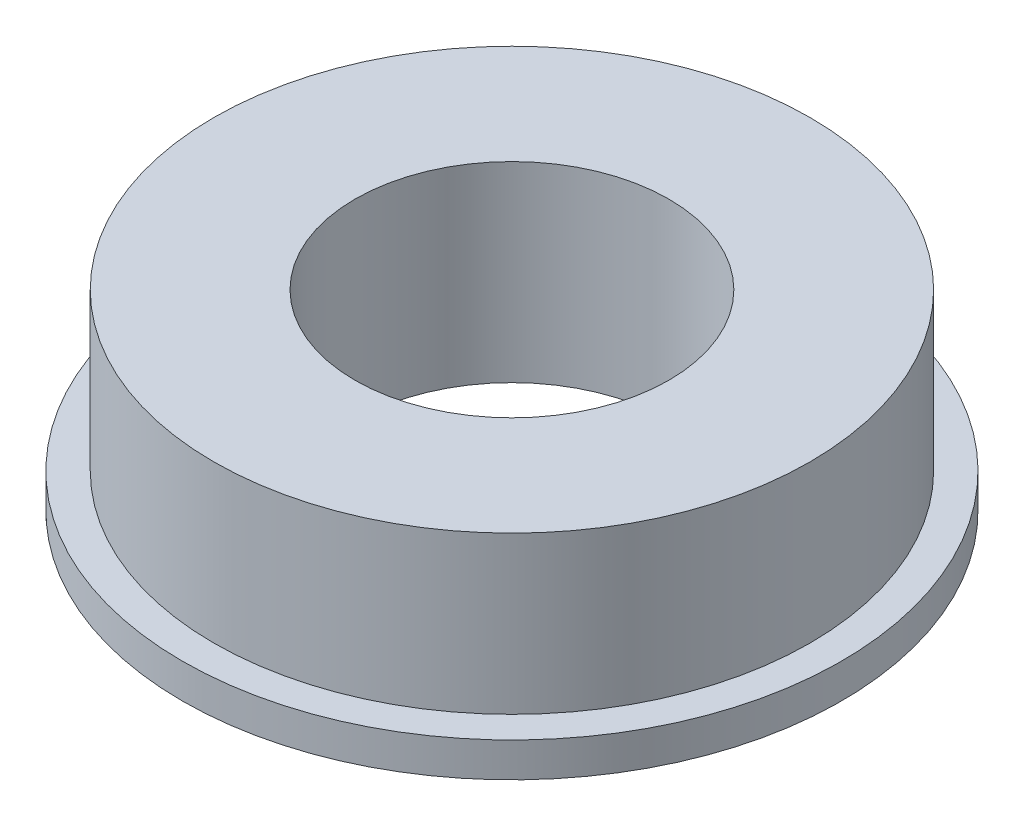
ISO-10303-21;
HEADER;
FILE_DESCRIPTION(('STEP AP214'),'2;1');
FILE_NAME('part.step','',(''),(''),'','','');
FILE_SCHEMA(('AUTOMOTIVE_DESIGN { 1 0 10303 214 1 1 1 1 }'));
ENDSEC;
DATA;
#1=APPLICATION_CONTEXT('core data for automotive mechanical design processes');
#2=APPLICATION_PROTOCOL_DEFINITION('international standard','automotive_design',2000,#1);
#3=PRODUCT_CONTEXT('',#1,'mechanical');
#4=PRODUCT('Part','Part','',(#3));
#5=PRODUCT_RELATED_PRODUCT_CATEGORY('part','',(#4));
#6=PRODUCT_DEFINITION_FORMATION('','',#4);
#7=PRODUCT_DEFINITION_CONTEXT('part definition',#1,'design');
#8=PRODUCT_DEFINITION('design','',#6,#7);
#9=PRODUCT_DEFINITION_SHAPE('','',#8);
#10=(LENGTH_UNIT() NAMED_UNIT(*) SI_UNIT(.MILLI.,.METRE.));
#11=(NAMED_UNIT(*) PLANE_ANGLE_UNIT() SI_UNIT($,.RADIAN.));
#12=(NAMED_UNIT(*) SI_UNIT($,.STERADIAN.) SOLID_ANGLE_UNIT());
#13=UNCERTAINTY_MEASURE_WITH_UNIT(LENGTH_MEASURE(1.E-05),#10,'distance_accuracy_value','');
#14=(GEOMETRIC_REPRESENTATION_CONTEXT(3) GLOBAL_UNCERTAINTY_ASSIGNED_CONTEXT((#13)) GLOBAL_UNIT_ASSIGNED_CONTEXT((#10,
#11,#12)) REPRESENTATION_CONTEXT('',''));
#15=CARTESIAN_POINT('',(0.,0.,0.));
#16=DIRECTION('',(0.,0.,1.));
#17=DIRECTION('',(1.,0.,0.));
#18=AXIS2_PLACEMENT_3D('',#15,#16,#17);
#19=CARTESIAN_POINT('',(0.,1.1,0.));
#20=DIRECTION('',(0.,1.,0.));
#21=DIRECTION('',(0.,0.,1.));
#22=AXIS2_PLACEMENT_3D('',#19,#20,#21);
#23=PLANE('',#22);
#24=CARTESIAN_POINT('',(0.,1.1,0.));
#25=DIRECTION('',(0.,1.,0.));
#26=DIRECTION('',(0.,0.,1.));
#27=AXIS2_PLACEMENT_3D('',#24,#25,#26);
#28=CIRCLE('',#27,9.5);
#29=CARTESIAN_POINT('',(0.,1.1,9.5));
#30=VERTEX_POINT('',#29);
#31=EDGE_CURVE('E10',#30,#30,#28,.T.);
#32=ORIENTED_EDGE('',*,*,#31,.F.);
#33=EDGE_LOOP('',(#32));
#34=FACE_BOUND('',#33,.T.);
#35=CARTESIAN_POINT('',(0.,1.1,0.));
#36=DIRECTION('',(0.,1.,0.));
#37=DIRECTION('',(0.,0.,1.));
#38=AXIS2_PLACEMENT_3D('',#35,#36,#37);
#39=CIRCLE('',#38,10.5);
#40=CARTESIAN_POINT('',(0.,1.1,10.5));
#41=VERTEX_POINT('',#40);
#42=EDGE_CURVE('E41',#41,#41,#39,.T.);
#43=ORIENTED_EDGE('',*,*,#42,.T.);
#44=EDGE_LOOP('',(#43));
#45=FACE_BOUND('',#44,.T.);
#46=ADVANCED_FACE('F33',(#34,#45),#23,.T.);
#47=CARTESIAN_POINT('',(0.,0.,0.));
#48=DIRECTION('',(0.,1.,0.));
#49=DIRECTION('',(0.,0.,1.));
#50=AXIS2_PLACEMENT_3D('',#47,#48,#49);
#51=PLANE('',#50);
#52=CARTESIAN_POINT('',(0.,0.,0.));
#53=DIRECTION('',(0.,1.,0.));
#54=DIRECTION('',(0.,0.,1.));
#55=AXIS2_PLACEMENT_3D('',#52,#53,#54);
#56=CIRCLE('',#55,10.5);
#57=CARTESIAN_POINT('',(0.,0.,10.5));
#58=VERTEX_POINT('',#57);
#59=EDGE_CURVE('E37',#58,#58,#56,.T.);
#60=ORIENTED_EDGE('',*,*,#59,.F.);
#61=EDGE_LOOP('',(#60));
#62=FACE_BOUND('',#61,.T.);
#63=CARTESIAN_POINT('',(0.,0.,0.));
#64=DIRECTION('',(0.,1.,0.));
#65=DIRECTION('',(0.,0.,1.));
#66=AXIS2_PLACEMENT_3D('',#63,#64,#65);
#67=CIRCLE('',#66,5.);
#68=CARTESIAN_POINT('',(0.,0.,5.));
#69=VERTEX_POINT('',#68);
#70=EDGE_CURVE('E50',#69,#69,#67,.T.);
#71=ORIENTED_EDGE('',*,*,#70,.T.);
#72=EDGE_LOOP('',(#71));
#73=FACE_BOUND('',#72,.T.);
#74=ADVANCED_FACE('F77',(#62,#73),#51,.F.);
#75=CARTESIAN_POINT('',(0.,1.1,0.));
#76=DIRECTION('',(0.,-1.,0.));
#77=DIRECTION('',(0.,0.,-1.));
#78=AXIS2_PLACEMENT_3D('',#75,#76,#77);
#79=CYLINDRICAL_SURFACE('',#78,10.5);
#80=ORIENTED_EDGE('',*,*,#42,.F.);
#81=EDGE_LOOP('',(#80));
#82=FACE_BOUND('',#81,.T.);
#83=ORIENTED_EDGE('',*,*,#59,.T.);
#84=EDGE_LOOP('',(#83));
#85=FACE_BOUND('',#84,.T.);
#86=ADVANCED_FACE('F35',(#82,#85),#79,.T.);
#87=CARTESIAN_POINT('',(0.,1.1,0.));
#88=DIRECTION('',(0.,-1.,0.));
#89=DIRECTION('',(0.,0.,-1.));
#90=AXIS2_PLACEMENT_3D('',#87,#88,#89);
#91=CYLINDRICAL_SURFACE('',#90,5.);
#92=ORIENTED_EDGE('',*,*,#70,.F.);
#93=EDGE_LOOP('',(#92));
#94=FACE_BOUND('',#93,.T.);
#95=CARTESIAN_POINT('',(0.,6.1,0.));
#96=DIRECTION('',(0.,1.,0.));
#97=DIRECTION('',(0.,0.,1.));
#98=AXIS2_PLACEMENT_3D('',#95,#96,#97);
#99=CIRCLE('',#98,5.);
#100=CARTESIAN_POINT('',(0.,6.1,5.));
#101=VERTEX_POINT('',#100);
#102=EDGE_CURVE('E56',#101,#101,#99,.T.);
#103=ORIENTED_EDGE('',*,*,#102,.T.);
#104=EDGE_LOOP('',(#103));
#105=FACE_BOUND('',#104,.T.);
#106=ADVANCED_FACE('F62',(#94,#105),#91,.F.);
#107=CARTESIAN_POINT('',(0.,6.1,0.));
#108=DIRECTION('',(0.,1.,0.));
#109=DIRECTION('',(0.,0.,1.));
#110=AXIS2_PLACEMENT_3D('',#107,#108,#109);
#111=PLANE('',#110);
#112=CARTESIAN_POINT('',(0.,6.1,0.));
#113=DIRECTION('',(0.,1.,0.));
#114=DIRECTION('',(0.,0.,1.));
#115=AXIS2_PLACEMENT_3D('',#112,#113,#114);
#116=CIRCLE('',#115,9.5);
#117=CARTESIAN_POINT('',(0.,6.1,9.5));
#118=VERTEX_POINT('',#117);
#119=EDGE_CURVE('E48',#118,#118,#116,.T.);
#120=ORIENTED_EDGE('',*,*,#119,.T.);
#121=EDGE_LOOP('',(#120));
#122=FACE_BOUND('',#121,.T.);
#123=ORIENTED_EDGE('',*,*,#102,.F.);
#124=EDGE_LOOP('',(#123));
#125=FACE_BOUND('',#124,.T.);
#126=ADVANCED_FACE('F64',(#122,#125),#111,.T.);
#127=CARTESIAN_POINT('',(0.,6.1,0.));
#128=DIRECTION('',(0.,-1.,0.));
#129=DIRECTION('',(0.,0.,-1.));
#130=AXIS2_PLACEMENT_3D('',#127,#128,#129);
#131=CYLINDRICAL_SURFACE('',#130,9.5);
#132=ORIENTED_EDGE('',*,*,#119,.F.);
#133=EDGE_LOOP('',(#132));
#134=FACE_BOUND('',#133,.T.);
#135=ORIENTED_EDGE('',*,*,#31,.T.);
#136=EDGE_LOOP('',(#135));
#137=FACE_BOUND('',#136,.T.);
#138=ADVANCED_FACE('F66',(#134,#137),#131,.T.);
#139=CLOSED_SHELL('',(#46,#74,#86,#106,#126,#138));
#140=MANIFOLD_SOLID_BREP('B2',#139);
#141=ADVANCED_BREP_SHAPE_REPRESENTATION('',(#18,#140),#14);
#142=SHAPE_DEFINITION_REPRESENTATION(#9,#141);
ENDSEC;
END-ISO-10303-21;
